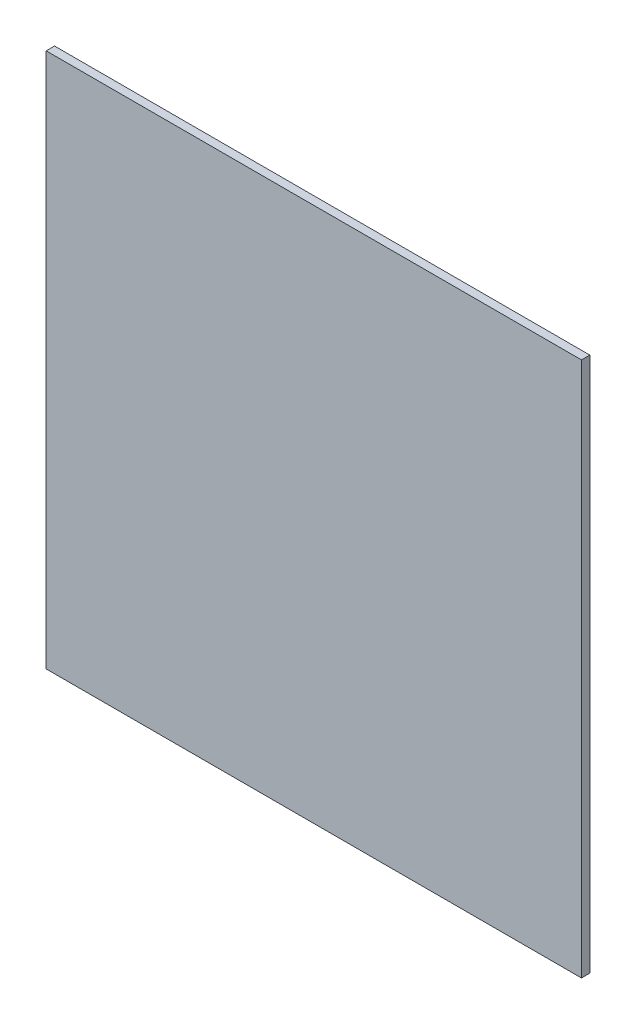
ISO-10303-21;
HEADER;
FILE_DESCRIPTION(('STEP AP214'),'2;1');
FILE_NAME('part.step','',(''),(''),'','','');
FILE_SCHEMA(('AUTOMOTIVE_DESIGN { 1 0 10303 214 1 1 1 1 }'));
ENDSEC;
DATA;
#1=APPLICATION_CONTEXT('core data for automotive mechanical design processes');
#2=APPLICATION_PROTOCOL_DEFINITION('international standard','automotive_design',2000,#1);
#3=PRODUCT_CONTEXT('',#1,'mechanical');
#4=PRODUCT('Part','Part','',(#3));
#5=PRODUCT_RELATED_PRODUCT_CATEGORY('part','',(#4));
#6=PRODUCT_DEFINITION_FORMATION('','',#4);
#7=PRODUCT_DEFINITION_CONTEXT('part definition',#1,'design');
#8=PRODUCT_DEFINITION('design','',#6,#7);
#9=PRODUCT_DEFINITION_SHAPE('','',#8);
#10=(LENGTH_UNIT() NAMED_UNIT(*) SI_UNIT(.MILLI.,.METRE.));
#11=(NAMED_UNIT(*) PLANE_ANGLE_UNIT() SI_UNIT($,.RADIAN.));
#12=(NAMED_UNIT(*) SI_UNIT($,.STERADIAN.) SOLID_ANGLE_UNIT());
#13=UNCERTAINTY_MEASURE_WITH_UNIT(LENGTH_MEASURE(1.E-05),#10,'distance_accuracy_value','');
#14=(GEOMETRIC_REPRESENTATION_CONTEXT(3) GLOBAL_UNCERTAINTY_ASSIGNED_CONTEXT((#13)) GLOBAL_UNIT_ASSIGNED_CONTEXT((#10,
#11,#12)) REPRESENTATION_CONTEXT('',''));
#15=CARTESIAN_POINT('',(0.,0.,0.));
#16=DIRECTION('',(0.,0.,1.));
#17=DIRECTION('',(1.,0.,0.));
#18=AXIS2_PLACEMENT_3D('',#15,#16,#17);
#19=CARTESIAN_POINT('',(-609.599999999999,609.6,19.05));
#20=DIRECTION('',(1.,0.,0.));
#21=DIRECTION('',(0.,1.,0.));
#22=AXIS2_PLACEMENT_3D('',#19,#20,#21);
#23=PLANE('',#22);
#24=DIRECTION('',(0.,-1.,0.));
#25=VECTOR('',#24,1.);
#26=CARTESIAN_POINT('',(-609.599999999999,609.6,0.));
#27=LINE('',#26,#25);
#28=CARTESIAN_POINT('',(-609.599999999999,609.6,0.));
#29=VERTEX_POINT('',#28);
#30=CARTESIAN_POINT('',(-609.599999999999,-609.6,0.));
#31=VERTEX_POINT('',#30);
#32=EDGE_CURVE('E95',#29,#31,#27,.T.);
#33=ORIENTED_EDGE('',*,*,#32,.T.);
#34=DIRECTION('',(0.,0.,-1.));
#35=VECTOR('',#34,1.);
#36=CARTESIAN_POINT('',(-609.599999999999,-609.6,19.05));
#37=LINE('',#36,#35);
#38=CARTESIAN_POINT('',(-609.599999999999,-609.6,19.05));
#39=VERTEX_POINT('',#38);
#40=EDGE_CURVE('E11',#39,#31,#37,.T.);
#41=ORIENTED_EDGE('',*,*,#40,.F.);
#42=DIRECTION('',(0.,-1.,0.));
#43=VECTOR('',#42,1.);
#44=CARTESIAN_POINT('',(-609.599999999999,609.6,19.05));
#45=LINE('',#44,#43);
#46=CARTESIAN_POINT('',(-609.599999999999,609.6,19.05));
#47=VERTEX_POINT('',#46);
#48=EDGE_CURVE('E83',#47,#39,#45,.T.);
#49=ORIENTED_EDGE('',*,*,#48,.F.);
#50=DIRECTION('',(0.,0.,-1.));
#51=VECTOR('',#50,1.);
#52=CARTESIAN_POINT('',(-609.599999999999,609.6,19.05));
#53=LINE('',#52,#51);
#54=EDGE_CURVE('E91',#47,#29,#53,.T.);
#55=ORIENTED_EDGE('',*,*,#54,.T.);
#56=EDGE_LOOP('',(#33,#41,#49,#55));
#57=FACE_BOUND('',#56,.T.);
#58=ADVANCED_FACE('F32',(#57),#23,.F.);
#59=CARTESIAN_POINT('',(-609.599999999999,-609.6,19.05));
#60=DIRECTION('',(0.,1.,0.));
#61=DIRECTION('',(0.,0.,1.));
#62=AXIS2_PLACEMENT_3D('',#59,#60,#61);
#63=PLANE('',#62);
#64=DIRECTION('',(1.,0.,0.));
#65=VECTOR('',#64,1.);
#66=CARTESIAN_POINT('',(-609.599999999999,-609.6,0.));
#67=LINE('',#66,#65);
#68=CARTESIAN_POINT('',(609.6,-609.6,0.));
#69=VERTEX_POINT('',#68);
#70=EDGE_CURVE('E87',#31,#69,#67,.T.);
#71=ORIENTED_EDGE('',*,*,#70,.T.);
#72=DIRECTION('',(0.,0.,-1.));
#73=VECTOR('',#72,1.);
#74=CARTESIAN_POINT('',(609.6,-609.6,19.05));
#75=LINE('',#74,#73);
#76=CARTESIAN_POINT('',(609.6,-609.6,19.05));
#77=VERTEX_POINT('',#76);
#78=EDGE_CURVE('E40',#77,#69,#75,.T.);
#79=ORIENTED_EDGE('',*,*,#78,.F.);
#80=DIRECTION('',(1.,0.,0.));
#81=VECTOR('',#80,1.);
#82=CARTESIAN_POINT('',(-609.599999999999,-609.6,19.05));
#83=LINE('',#82,#81);
#84=EDGE_CURVE('E78',#39,#77,#83,.T.);
#85=ORIENTED_EDGE('',*,*,#84,.F.);
#86=ORIENTED_EDGE('',*,*,#40,.T.);
#87=EDGE_LOOP('',(#71,#79,#85,#86));
#88=FACE_BOUND('',#87,.T.);
#89=ADVANCED_FACE('F86',(#88),#63,.F.);
#90=CARTESIAN_POINT('',(609.599999999999,609.6,19.05));
#91=DIRECTION('',(-1.,0.,0.));
#92=DIRECTION('',(0.,-1.,0.));
#93=AXIS2_PLACEMENT_3D('',#90,#91,#92);
#94=PLANE('',#93);
#95=DIRECTION('',(0.,1.,0.));
#96=VECTOR('',#95,1.);
#97=CARTESIAN_POINT('',(609.599999999999,609.6,0.));
#98=LINE('',#97,#96);
#99=CARTESIAN_POINT('',(609.599999999999,609.6,0.));
#100=VERTEX_POINT('',#99);
#101=EDGE_CURVE('E65',#69,#100,#98,.T.);
#102=ORIENTED_EDGE('',*,*,#101,.T.);
#103=DIRECTION('',(0.,0.,-1.));
#104=VECTOR('',#103,1.);
#105=CARTESIAN_POINT('',(609.599999999999,609.6,19.05));
#106=LINE('',#105,#104);
#107=CARTESIAN_POINT('',(609.599999999999,609.6,19.05));
#108=VERTEX_POINT('',#107);
#109=EDGE_CURVE('E88',#108,#100,#106,.T.);
#110=ORIENTED_EDGE('',*,*,#109,.F.);
#111=DIRECTION('',(0.,1.,0.));
#112=VECTOR('',#111,1.);
#113=CARTESIAN_POINT('',(609.599999999999,609.6,19.05));
#114=LINE('',#113,#112);
#115=EDGE_CURVE('E81',#77,#108,#114,.T.);
#116=ORIENTED_EDGE('',*,*,#115,.F.);
#117=ORIENTED_EDGE('',*,*,#78,.T.);
#118=EDGE_LOOP('',(#102,#110,#116,#117));
#119=FACE_BOUND('',#118,.T.);
#120=ADVANCED_FACE('F89',(#119),#94,.F.);
#121=CARTESIAN_POINT('',(-609.599999999999,609.6,19.05));
#122=DIRECTION('',(0.,-1.,0.));
#123=DIRECTION('',(0.,0.,-1.));
#124=AXIS2_PLACEMENT_3D('',#121,#122,#123);
#125=PLANE('',#124);
#126=DIRECTION('',(-1.,0.,0.));
#127=VECTOR('',#126,1.);
#128=CARTESIAN_POINT('',(-609.599999999999,609.6,0.));
#129=LINE('',#128,#127);
#130=EDGE_CURVE('E71',#100,#29,#129,.T.);
#131=ORIENTED_EDGE('',*,*,#130,.T.);
#132=ORIENTED_EDGE('',*,*,#54,.F.);
#133=DIRECTION('',(-1.,0.,0.));
#134=VECTOR('',#133,1.);
#135=CARTESIAN_POINT('',(-609.599999999999,609.6,19.05));
#136=LINE('',#135,#134);
#137=EDGE_CURVE('E48',#108,#47,#136,.T.);
#138=ORIENTED_EDGE('',*,*,#137,.F.);
#139=ORIENTED_EDGE('',*,*,#109,.T.);
#140=EDGE_LOOP('',(#131,#132,#138,#139));
#141=FACE_BOUND('',#140,.T.);
#142=ADVANCED_FACE('F102',(#141),#125,.F.);
#143=CARTESIAN_POINT('',(0.,0.,19.05));
#144=DIRECTION('',(0.,0.,1.));
#145=DIRECTION('',(1.,0.,0.));
#146=AXIS2_PLACEMENT_3D('',#143,#144,#145);
#147=PLANE('',#146);
#148=ORIENTED_EDGE('',*,*,#48,.T.);
#149=ORIENTED_EDGE('',*,*,#84,.T.);
#150=ORIENTED_EDGE('',*,*,#115,.T.);
#151=ORIENTED_EDGE('',*,*,#137,.T.);
#152=EDGE_LOOP('',(#148,#149,#150,#151));
#153=FACE_BOUND('',#152,.T.);
#154=ADVANCED_FACE('F79',(#153),#147,.T.);
#155=CARTESIAN_POINT('',(0.,0.,0.));
#156=DIRECTION('',(0.,0.,1.));
#157=DIRECTION('',(1.,0.,0.));
#158=AXIS2_PLACEMENT_3D('',#155,#156,#157);
#159=PLANE('',#158);
#160=ORIENTED_EDGE('',*,*,#32,.F.);
#161=ORIENTED_EDGE('',*,*,#130,.F.);
#162=ORIENTED_EDGE('',*,*,#101,.F.);
#163=ORIENTED_EDGE('',*,*,#70,.F.);
#164=EDGE_LOOP('',(#160,#161,#162,#163));
#165=FACE_BOUND('',#164,.T.);
#166=ADVANCED_FACE('F105',(#165),#159,.F.);
#167=CLOSED_SHELL('',(#58,#89,#120,#142,#154,#166));
#168=MANIFOLD_SOLID_BREP('B2',#167);
#169=ADVANCED_BREP_SHAPE_REPRESENTATION('',(#18,#168),#14);
#170=SHAPE_DEFINITION_REPRESENTATION(#9,#169);
ENDSEC;
END-ISO-10303-21;
